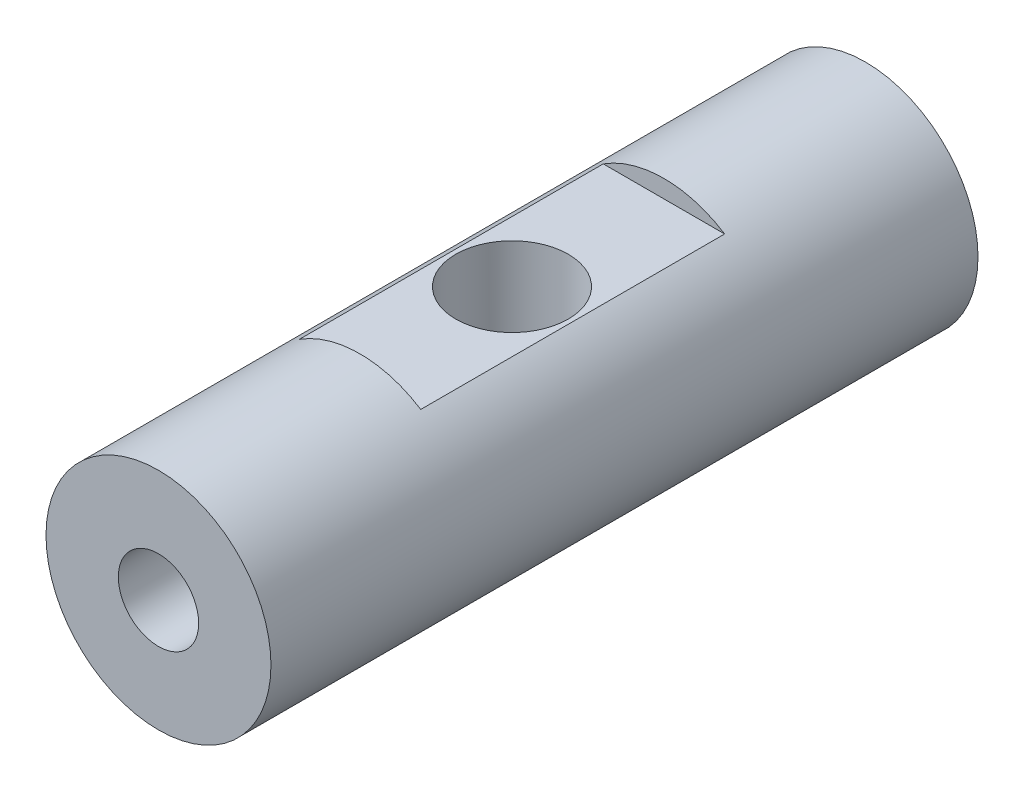
ISO-10303-21;
HEADER;
FILE_DESCRIPTION(('STEP AP214'),'2;1');
FILE_NAME('part.step','',(''),(''),'','','');
FILE_SCHEMA(('AUTOMOTIVE_DESIGN { 1 0 10303 214 1 1 1 1 }'));
ENDSEC;
DATA;
#1=APPLICATION_CONTEXT('core data for automotive mechanical design processes');
#2=APPLICATION_PROTOCOL_DEFINITION('international standard','automotive_design',2000,#1);
#3=PRODUCT_CONTEXT('',#1,'mechanical');
#4=PRODUCT('Part','Part','',(#3));
#5=PRODUCT_RELATED_PRODUCT_CATEGORY('part','',(#4));
#6=PRODUCT_DEFINITION_FORMATION('','',#4);
#7=PRODUCT_DEFINITION_CONTEXT('part definition',#1,'design');
#8=PRODUCT_DEFINITION('design','',#6,#7);
#9=PRODUCT_DEFINITION_SHAPE('','',#8);
#10=(LENGTH_UNIT() NAMED_UNIT(*) SI_UNIT(.MILLI.,.METRE.));
#11=(NAMED_UNIT(*) PLANE_ANGLE_UNIT() SI_UNIT($,.RADIAN.));
#12=(NAMED_UNIT(*) SI_UNIT($,.STERADIAN.) SOLID_ANGLE_UNIT());
#13=UNCERTAINTY_MEASURE_WITH_UNIT(LENGTH_MEASURE(1.E-05),#10,'distance_accuracy_value','');
#14=(GEOMETRIC_REPRESENTATION_CONTEXT(3) GLOBAL_UNCERTAINTY_ASSIGNED_CONTEXT((#13)) GLOBAL_UNIT_ASSIGNED_CONTEXT((#10,
#11,#12)) REPRESENTATION_CONTEXT('',''));
#15=CARTESIAN_POINT('',(0.,0.,0.));
#16=DIRECTION('',(0.,0.,1.));
#17=DIRECTION('',(1.,0.,0.));
#18=AXIS2_PLACEMENT_3D('',#15,#16,#17);
#19=CARTESIAN_POINT('',(0.,0.,44.));
#20=DIRECTION('',(0.,0.,-1.));
#21=DIRECTION('',(-1.,0.,0.));
#22=AXIS2_PLACEMENT_3D('',#19,#20,#21);
#23=CYLINDRICAL_SURFACE('',#22,7.);
#24=CARTESIAN_POINT('',(0.,0.,31.4563702965126));
#25=DIRECTION('',(0.,0.,1.));
#26=DIRECTION('',(1.,0.,0.));
#27=AXIS2_PLACEMENT_3D('',#24,#25,#26);
#28=CIRCLE('',#27,7.);
#29=CARTESIAN_POINT('',(3.77790600258319,5.89299806852556,31.4563702965126));
#30=VERTEX_POINT('',#29);
#31=CARTESIAN_POINT('',(-3.77790600258318,5.89299806852556,31.4563702965126));
#32=VERTEX_POINT('',#31);
#33=EDGE_CURVE('E11',#30,#32,#28,.T.);
#34=ORIENTED_EDGE('',*,*,#33,.T.);
#35=DIRECTION('',(0.,0.,-1.));
#36=VECTOR('',#35,1.);
#37=CARTESIAN_POINT('',(-3.77790600258319,5.89299806852556,44.));
#38=LINE('',#37,#36);
#39=CARTESIAN_POINT('',(-3.77790600258318,5.89299806852556,12.5436297034874));
#40=VERTEX_POINT('',#39);
#41=EDGE_CURVE('E99',#32,#40,#38,.T.);
#42=ORIENTED_EDGE('',*,*,#41,.T.);
#43=CARTESIAN_POINT('',(0.,0.,12.5436297034874));
#44=DIRECTION('',(0.,0.,-1.));
#45=DIRECTION('',(-1.,0.,0.));
#46=AXIS2_PLACEMENT_3D('',#43,#44,#45);
#47=CIRCLE('',#46,7.);
#48=CARTESIAN_POINT('',(3.77790600258319,5.89299806852556,12.5436297034874));
#49=VERTEX_POINT('',#48);
#50=EDGE_CURVE('E40',#40,#49,#47,.T.);
#51=ORIENTED_EDGE('',*,*,#50,.T.);
#52=DIRECTION('',(0.,0.,-1.));
#53=VECTOR('',#52,1.);
#54=CARTESIAN_POINT('',(3.77790600258319,5.89299806852556,44.));
#55=LINE('',#54,#53);
#56=EDGE_CURVE('E92',#49,#30,#55,.F.);
#57=ORIENTED_EDGE('',*,*,#56,.T.);
#58=EDGE_LOOP('',(#34,#42,#51,#57));
#59=FACE_BOUND('',#58,.T.);
#60=DIRECTION('',(0.,0.,-1.));
#61=VECTOR('',#60,1.);
#62=CARTESIAN_POINT('',(-3.77790600258319,-5.89299806852556,44.));
#63=LINE('',#62,#61);
#64=CARTESIAN_POINT('',(-3.77790600258319,-5.89299806852556,12.5436297034874));
#65=VERTEX_POINT('',#64);
#66=CARTESIAN_POINT('',(-3.77790600258318,-5.89299806852556,31.4563702965126));
#67=VERTEX_POINT('',#66);
#68=EDGE_CURVE('E84',#65,#67,#63,.F.);
#69=ORIENTED_EDGE('',*,*,#68,.T.);
#70=CARTESIAN_POINT('',(0.,0.,31.4563702965126));
#71=DIRECTION('',(0.,0.,1.));
#72=DIRECTION('',(1.,0.,0.));
#73=AXIS2_PLACEMENT_3D('',#70,#71,#72);
#74=CIRCLE('',#73,7.);
#75=CARTESIAN_POINT('',(3.77790600258319,-5.89299806852556,31.4563702965126));
#76=VERTEX_POINT('',#75);
#77=EDGE_CURVE('E76',#67,#76,#74,.T.);
#78=ORIENTED_EDGE('',*,*,#77,.T.);
#79=DIRECTION('',(0.,0.,-1.));
#80=VECTOR('',#79,1.);
#81=CARTESIAN_POINT('',(3.77790600258319,-5.89299806852556,44.));
#82=LINE('',#81,#80);
#83=CARTESIAN_POINT('',(3.77790600258319,-5.89299806852556,12.5436297034874));
#84=VERTEX_POINT('',#83);
#85=EDGE_CURVE('E82',#76,#84,#82,.T.);
#86=ORIENTED_EDGE('',*,*,#85,.T.);
#87=CARTESIAN_POINT('',(0.,0.,12.5436297034874));
#88=DIRECTION('',(0.,0.,-1.));
#89=DIRECTION('',(-1.,0.,0.));
#90=AXIS2_PLACEMENT_3D('',#87,#88,#89);
#91=CIRCLE('',#90,7.);
#92=EDGE_CURVE('E71',#84,#65,#91,.T.);
#93=ORIENTED_EDGE('',*,*,#92,.T.);
#94=EDGE_LOOP('',(#69,#78,#86,#93));
#95=FACE_BOUND('',#94,.T.);
#96=CARTESIAN_POINT('',(0.,0.,44.));
#97=DIRECTION('',(0.,0.,1.));
#98=DIRECTION('',(1.,0.,0.));
#99=AXIS2_PLACEMENT_3D('',#96,#97,#98);
#100=CIRCLE('',#99,7.);
#101=CARTESIAN_POINT('',(7.,0.,44.));
#102=VERTEX_POINT('',#101);
#103=EDGE_CURVE('E77',#102,#102,#100,.T.);
#104=ORIENTED_EDGE('',*,*,#103,.F.);
#105=EDGE_LOOP('',(#104));
#106=FACE_BOUND('',#105,.T.);
#107=CARTESIAN_POINT('',(0.,0.,0.));
#108=DIRECTION('',(0.,0.,1.));
#109=DIRECTION('',(1.,0.,0.));
#110=AXIS2_PLACEMENT_3D('',#107,#108,#109);
#111=CIRCLE('',#110,7.);
#112=CARTESIAN_POINT('',(7.,0.,0.));
#113=VERTEX_POINT('',#112);
#114=EDGE_CURVE('E112',#113,#113,#111,.T.);
#115=ORIENTED_EDGE('',*,*,#114,.T.);
#116=EDGE_LOOP('',(#115));
#117=FACE_BOUND('',#116,.T.);
#118=ADVANCED_FACE('F33',(#59,#95,#106,#117),#23,.T.);
#119=CARTESIAN_POINT('',(0.,0.,44.));
#120=DIRECTION('',(0.,0.,1.));
#121=DIRECTION('',(1.,0.,0.));
#122=AXIS2_PLACEMENT_3D('',#119,#120,#121);
#123=PLANE('',#122);
#124=CARTESIAN_POINT('',(0.,0.,44.));
#125=DIRECTION('',(0.,0.,1.));
#126=DIRECTION('',(1.,0.,0.));
#127=AXIS2_PLACEMENT_3D('',#124,#125,#126);
#128=CIRCLE('',#127,2.5);
#129=CARTESIAN_POINT('',(2.5,0.,44.));
#130=VERTEX_POINT('',#129);
#131=EDGE_CURVE('E106',#130,#130,#128,.T.);
#132=ORIENTED_EDGE('',*,*,#131,.F.);
#133=EDGE_LOOP('',(#132));
#134=FACE_BOUND('',#133,.T.);
#135=ORIENTED_EDGE('',*,*,#103,.T.);
#136=EDGE_LOOP('',(#135));
#137=FACE_BOUND('',#136,.T.);
#138=ADVANCED_FACE('F148',(#134,#137),#123,.T.);
#139=CARTESIAN_POINT('',(0.,0.,0.));
#140=DIRECTION('',(0.,0.,1.));
#141=DIRECTION('',(1.,0.,0.));
#142=AXIS2_PLACEMENT_3D('',#139,#140,#141);
#143=PLANE('',#142);
#144=CARTESIAN_POINT('',(0.,0.,0.));
#145=DIRECTION('',(0.,0.,-1.));
#146=DIRECTION('',(-1.,0.,0.));
#147=AXIS2_PLACEMENT_3D('',#144,#145,#146);
#148=CIRCLE('',#147,2.5);
#149=CARTESIAN_POINT('',(-2.5,0.,0.));
#150=VERTEX_POINT('',#149);
#151=EDGE_CURVE('E102',#150,#150,#148,.T.);
#152=ORIENTED_EDGE('',*,*,#151,.F.);
#153=EDGE_LOOP('',(#152));
#154=FACE_BOUND('',#153,.T.);
#155=ORIENTED_EDGE('',*,*,#114,.F.);
#156=EDGE_LOOP('',(#155));
#157=FACE_BOUND('',#156,.T.);
#158=ADVANCED_FACE('F152',(#154,#157),#143,.F.);
#159=CARTESIAN_POINT('',(0.,0.,34.));
#160=DIRECTION('',(0.,0.,1.));
#161=DIRECTION('',(1.,0.,0.));
#162=AXIS2_PLACEMENT_3D('',#159,#160,#161);
#163=CYLINDRICAL_SURFACE('',#162,2.5);
#164=CARTESIAN_POINT('',(0.,0.,34.));
#165=DIRECTION('',(0.,0.,1.));
#166=DIRECTION('',(1.,0.,0.));
#167=AXIS2_PLACEMENT_3D('',#164,#165,#166);
#168=CIRCLE('',#167,2.5);
#169=CARTESIAN_POINT('',(2.5,0.,34.));
#170=VERTEX_POINT('',#169);
#171=EDGE_CURVE('E109',#170,#170,#168,.T.);
#172=ORIENTED_EDGE('',*,*,#171,.F.);
#173=EDGE_LOOP('',(#172));
#174=FACE_BOUND('',#173,.T.);
#175=ORIENTED_EDGE('',*,*,#131,.T.);
#176=EDGE_LOOP('',(#175));
#177=FACE_BOUND('',#176,.T.);
#178=ADVANCED_FACE('F158',(#174,#177),#163,.F.);
#179=CARTESIAN_POINT('',(0.,0.,34.));
#180=DIRECTION('',(0.,0.,1.));
#181=DIRECTION('',(1.,0.,0.));
#182=AXIS2_PLACEMENT_3D('',#179,#180,#181);
#183=PLANE('',#182);
#184=ORIENTED_EDGE('',*,*,#171,.T.);
#185=EDGE_LOOP('',(#184));
#186=FACE_BOUND('',#185,.T.);
#187=ADVANCED_FACE('F165',(#186),#183,.T.);
#188=CARTESIAN_POINT('',(0.,0.,10.));
#189=DIRECTION('',(0.,0.,-1.));
#190=DIRECTION('',(-1.,0.,0.));
#191=AXIS2_PLACEMENT_3D('',#188,#189,#190);
#192=CYLINDRICAL_SURFACE('',#191,2.5);
#193=CARTESIAN_POINT('',(0.,0.,10.));
#194=DIRECTION('',(0.,0.,-1.));
#195=DIRECTION('',(-1.,0.,0.));
#196=AXIS2_PLACEMENT_3D('',#193,#194,#195);
#197=CIRCLE('',#196,2.5);
#198=CARTESIAN_POINT('',(-2.5,0.,10.));
#199=VERTEX_POINT('',#198);
#200=EDGE_CURVE('E103',#199,#199,#197,.T.);
#201=ORIENTED_EDGE('',*,*,#200,.F.);
#202=EDGE_LOOP('',(#201));
#203=FACE_BOUND('',#202,.T.);
#204=ORIENTED_EDGE('',*,*,#151,.T.);
#205=EDGE_LOOP('',(#204));
#206=FACE_BOUND('',#205,.T.);
#207=ADVANCED_FACE('F142',(#203,#206),#192,.F.);
#208=CARTESIAN_POINT('',(0.,0.,10.));
#209=DIRECTION('',(0.,0.,-1.));
#210=DIRECTION('',(-1.,0.,0.));
#211=AXIS2_PLACEMENT_3D('',#208,#209,#210);
#212=PLANE('',#211);
#213=ORIENTED_EDGE('',*,*,#200,.T.);
#214=EDGE_LOOP('',(#213));
#215=FACE_BOUND('',#214,.T.);
#216=ADVANCED_FACE('F135',(#215),#212,.T.);
#217=CARTESIAN_POINT('',(-35.,-8.10700193147444,31.4563702965126));
#218=DIRECTION('',(0.,0.,1.));
#219=DIRECTION('',(1.,0.,0.));
#220=AXIS2_PLACEMENT_3D('',#217,#218,#219);
#221=PLANE('',#220);
#222=DIRECTION('',(1.,0.,0.));
#223=VECTOR('',#222,1.);
#224=CARTESIAN_POINT('',(-35.,-5.89299806852556,31.4563702965126));
#225=LINE('',#224,#223);
#226=EDGE_CURVE('E85',#67,#76,#225,.T.);
#227=ORIENTED_EDGE('',*,*,#226,.T.);
#228=ORIENTED_EDGE('',*,*,#77,.F.);
#229=EDGE_LOOP('',(#227,#228));
#230=FACE_BOUND('',#229,.T.);
#231=ADVANCED_FACE('F133',(#230),#221,.F.);
#232=CARTESIAN_POINT('',(-35.,-8.10700193147444,12.5436297034874));
#233=DIRECTION('',(0.,0.,-1.));
#234=DIRECTION('',(-1.,0.,0.));
#235=AXIS2_PLACEMENT_3D('',#232,#233,#234);
#236=PLANE('',#235);
#237=DIRECTION('',(1.,0.,0.));
#238=VECTOR('',#237,1.);
#239=CARTESIAN_POINT('',(-35.,-5.89299806852556,12.5436297034874));
#240=LINE('',#239,#238);
#241=EDGE_CURVE('E54',#65,#84,#240,.T.);
#242=ORIENTED_EDGE('',*,*,#241,.F.);
#243=ORIENTED_EDGE('',*,*,#92,.F.);
#244=EDGE_LOOP('',(#242,#243));
#245=FACE_BOUND('',#244,.T.);
#246=ADVANCED_FACE('F72',(#245),#236,.F.);
#247=CARTESIAN_POINT('',(-35.,-5.89299806852556,12.5436297034874));
#248=DIRECTION('',(0.,1.,0.));
#249=DIRECTION('',(0.,0.,1.));
#250=AXIS2_PLACEMENT_3D('',#247,#248,#249);
#251=PLANE('',#250);
#252=CARTESIAN_POINT('',(0.,-5.89299806852556,22.));
#253=DIRECTION('',(0.,1.,0.));
#254=DIRECTION('',(0.,0.,1.));
#255=AXIS2_PLACEMENT_3D('',#252,#253,#254);
#256=CIRCLE('',#255,3.5);
#257=CARTESIAN_POINT('',(0.,-5.89299806852556,25.5));
#258=VERTEX_POINT('',#257);
#259=EDGE_CURVE('E94',#258,#258,#256,.F.);
#260=ORIENTED_EDGE('',*,*,#259,.F.);
#261=EDGE_LOOP('',(#260));
#262=FACE_BOUND('',#261,.T.);
#263=ORIENTED_EDGE('',*,*,#226,.F.);
#264=ORIENTED_EDGE('',*,*,#68,.F.);
#265=ORIENTED_EDGE('',*,*,#241,.T.);
#266=ORIENTED_EDGE('',*,*,#85,.F.);
#267=EDGE_LOOP('',(#263,#264,#265,#266));
#268=FACE_BOUND('',#267,.T.);
#269=ADVANCED_FACE('F81',(#262,#268),#251,.F.);
#270=CARTESIAN_POINT('',(-35.,8.10700193147444,31.4563702965126));
#271=DIRECTION('',(0.,0.,1.));
#272=DIRECTION('',(1.,0.,0.));
#273=AXIS2_PLACEMENT_3D('',#270,#271,#272);
#274=PLANE('',#273);
#275=DIRECTION('',(1.,0.,0.));
#276=VECTOR('',#275,1.);
#277=CARTESIAN_POINT('',(-35.,5.89299806852556,31.4563702965126));
#278=LINE('',#277,#276);
#279=EDGE_CURVE('E47',#32,#30,#278,.T.);
#280=ORIENTED_EDGE('',*,*,#279,.F.);
#281=ORIENTED_EDGE('',*,*,#33,.F.);
#282=EDGE_LOOP('',(#280,#281));
#283=FACE_BOUND('',#282,.T.);
#284=ADVANCED_FACE('F177',(#283),#274,.F.);
#285=CARTESIAN_POINT('',(-35.,8.10700193147444,12.5436297034874));
#286=DIRECTION('',(0.,0.,-1.));
#287=DIRECTION('',(-1.,0.,0.));
#288=AXIS2_PLACEMENT_3D('',#285,#286,#287);
#289=PLANE('',#288);
#290=DIRECTION('',(1.,0.,0.));
#291=VECTOR('',#290,1.);
#292=CARTESIAN_POINT('',(-35.,5.89299806852556,12.5436297034874));
#293=LINE('',#292,#291);
#294=EDGE_CURVE('E120',#40,#49,#293,.T.);
#295=ORIENTED_EDGE('',*,*,#294,.T.);
#296=ORIENTED_EDGE('',*,*,#50,.F.);
#297=EDGE_LOOP('',(#295,#296));
#298=FACE_BOUND('',#297,.T.);
#299=ADVANCED_FACE('F127',(#298),#289,.F.);
#300=CARTESIAN_POINT('',(-35.,5.89299806852556,12.5436297034874));
#301=DIRECTION('',(0.,-1.,0.));
#302=DIRECTION('',(0.,0.,-1.));
#303=AXIS2_PLACEMENT_3D('',#300,#301,#302);
#304=PLANE('',#303);
#305=CARTESIAN_POINT('',(0.,5.89299806852556,22.));
#306=DIRECTION('',(0.,-1.,0.));
#307=DIRECTION('',(0.,0.,-1.));
#308=AXIS2_PLACEMENT_3D('',#305,#306,#307);
#309=CIRCLE('',#308,3.5);
#310=CARTESIAN_POINT('',(0.,5.89299806852556,18.5));
#311=VERTEX_POINT('',#310);
#312=EDGE_CURVE('E89',#311,#311,#309,.F.);
#313=ORIENTED_EDGE('',*,*,#312,.F.);
#314=EDGE_LOOP('',(#313));
#315=FACE_BOUND('',#314,.T.);
#316=ORIENTED_EDGE('',*,*,#279,.T.);
#317=ORIENTED_EDGE('',*,*,#56,.F.);
#318=ORIENTED_EDGE('',*,*,#294,.F.);
#319=ORIENTED_EDGE('',*,*,#41,.F.);
#320=EDGE_LOOP('',(#316,#317,#318,#319));
#321=FACE_BOUND('',#320,.T.);
#322=ADVANCED_FACE('F128',(#315,#321),#304,.F.);
#323=CARTESIAN_POINT('',(0.,-20.,22.));
#324=DIRECTION('',(0.,1.,0.));
#325=DIRECTION('',(0.,0.,1.));
#326=AXIS2_PLACEMENT_3D('',#323,#324,#325);
#327=CYLINDRICAL_SURFACE('',#326,3.5);
#328=ORIENTED_EDGE('',*,*,#312,.T.);
#329=EDGE_LOOP('',(#328));
#330=FACE_BOUND('',#329,.T.);
#331=ORIENTED_EDGE('',*,*,#259,.T.);
#332=EDGE_LOOP('',(#331));
#333=FACE_BOUND('',#332,.T.);
#334=ADVANCED_FACE('F173',(#330,#333),#327,.F.);
#335=CLOSED_SHELL('',(#118,#138,#158,#178,#187,#207,#216,#231,#246,#269,#284,#299,#322,#334));
#336=MANIFOLD_SOLID_BREP('B2',#335);
#337=ADVANCED_BREP_SHAPE_REPRESENTATION('',(#18,#336),#14);
#338=SHAPE_DEFINITION_REPRESENTATION(#9,#337);
ENDSEC;
END-ISO-10303-21;
